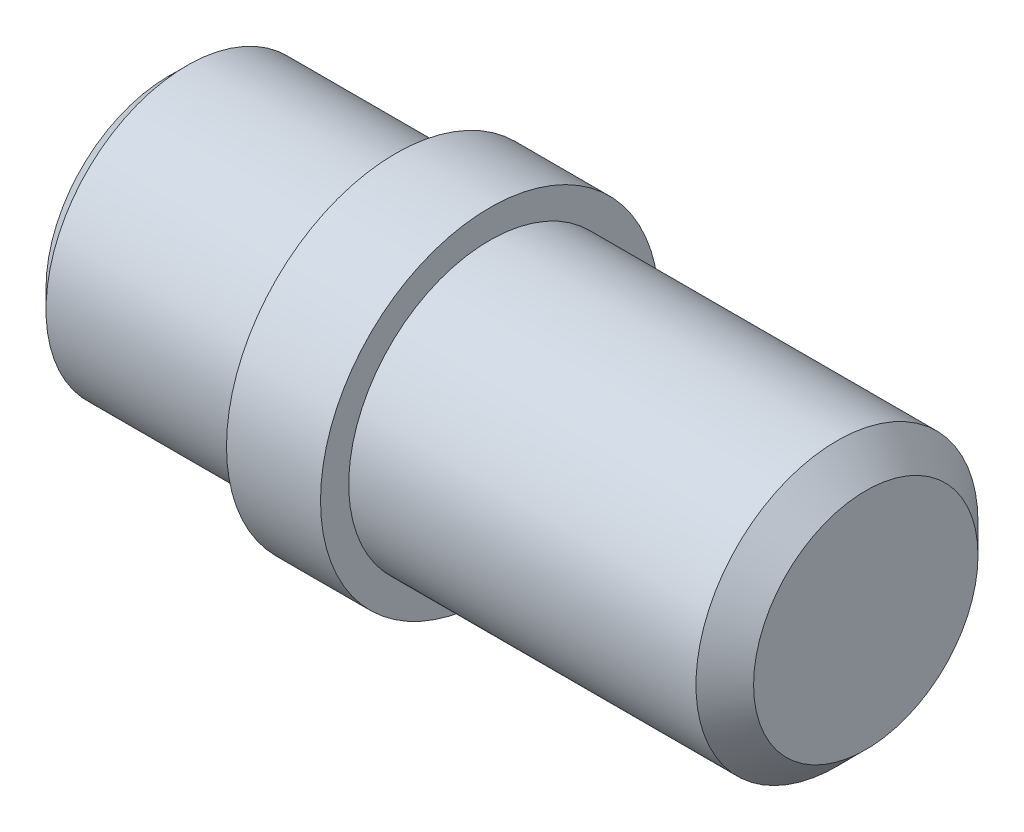
ISO-10303-21;
HEADER;
FILE_DESCRIPTION(('STEP AP214'),'2;1');
FILE_NAME('part.step','',(''),(''),'','','');
FILE_SCHEMA(('AUTOMOTIVE_DESIGN { 1 0 10303 214 1 1 1 1 }'));
ENDSEC;
DATA;
#1=APPLICATION_CONTEXT('core data for automotive mechanical design processes');
#2=APPLICATION_PROTOCOL_DEFINITION('international standard','automotive_design',2000,#1);
#3=PRODUCT_CONTEXT('',#1,'mechanical');
#4=PRODUCT('Part','Part','',(#3));
#5=PRODUCT_RELATED_PRODUCT_CATEGORY('part','',(#4));
#6=PRODUCT_DEFINITION_FORMATION('','',#4);
#7=PRODUCT_DEFINITION_CONTEXT('part definition',#1,'design');
#8=PRODUCT_DEFINITION('design','',#6,#7);
#9=PRODUCT_DEFINITION_SHAPE('','',#8);
#10=(LENGTH_UNIT() NAMED_UNIT(*) SI_UNIT(.MILLI.,.METRE.));
#11=(NAMED_UNIT(*) PLANE_ANGLE_UNIT() SI_UNIT($,.RADIAN.));
#12=(NAMED_UNIT(*) SI_UNIT($,.STERADIAN.) SOLID_ANGLE_UNIT());
#13=UNCERTAINTY_MEASURE_WITH_UNIT(LENGTH_MEASURE(1.E-05),#10,'distance_accuracy_value','');
#14=(GEOMETRIC_REPRESENTATION_CONTEXT(3) GLOBAL_UNCERTAINTY_ASSIGNED_CONTEXT((#13)) GLOBAL_UNIT_ASSIGNED_CONTEXT((#10,
#11,#12)) REPRESENTATION_CONTEXT('',''));
#15=CARTESIAN_POINT('',(0.,0.,0.));
#16=DIRECTION('',(0.,0.,1.));
#17=DIRECTION('',(1.,0.,0.));
#18=AXIS2_PLACEMENT_3D('',#15,#16,#17);
#19=CARTESIAN_POINT('',(-0.92,-0.86602540378444,0.375));
#20=DIRECTION('',(-1.,0.,0.));
#21=DIRECTION('',(0.,1.,0.));
#22=AXIS2_PLACEMENT_3D('',#19,#20,#21);
#23=PLANE('',#22);
#24=CARTESIAN_POINT('',(-0.92,0.,0.));
#25=DIRECTION('',(1.,0.,0.));
#26=DIRECTION('',(0.,-0.866025403784439,0.5));
#27=AXIS2_PLACEMENT_3D('',#24,#25,#26);
#28=CIRCLE('',#27,0.75);
#29=CARTESIAN_POINT('',(-0.92,-0.649519052838329,-0.375));
#30=VERTEX_POINT('',#29);
#31=CARTESIAN_POINT('',(-0.92,-0.649519052838329,0.375));
#32=VERTEX_POINT('',#31);
#33=EDGE_CURVE('E93',#30,#32,#28,.F.);
#34=ORIENTED_EDGE('',*,*,#33,.F.);
#35=DIRECTION('',(0.,-0.500000000000001,0.866025403784438));
#36=VECTOR('',#35,1.);
#37=CARTESIAN_POINT('',(-0.92,-0.64951905283833,-0.375));
#38=LINE('',#37,#36);
#39=CARTESIAN_POINT('',(-0.92,-0.86602540378444,0.));
#40=VERTEX_POINT('',#39);
#41=EDGE_CURVE('E107',#40,#30,#38,.F.);
#42=ORIENTED_EDGE('',*,*,#41,.F.);
#43=DIRECTION('',(0.,0.500000000000001,0.866025403784438));
#44=VECTOR('',#43,1.);
#45=CARTESIAN_POINT('',(-0.92,-0.86602540378444,0.));
#46=LINE('',#45,#44);
#47=EDGE_CURVE('E109',#32,#40,#46,.F.);
#48=ORIENTED_EDGE('',*,*,#47,.F.);
#49=EDGE_LOOP('',(#34,#42,#48));
#50=FACE_BOUND('',#49,.T.);
#51=ADVANCED_FACE('F17',(#50),#23,.T.);
#52=CARTESIAN_POINT('',(-0.92,-0.64951905283833,0.75));
#53=DIRECTION('',(-1.,0.,0.));
#54=DIRECTION('',(0.,1.,0.));
#55=AXIS2_PLACEMENT_3D('',#52,#53,#54);
#56=PLANE('',#55);
#57=CARTESIAN_POINT('',(-0.92,0.,0.));
#58=DIRECTION('',(1.,0.,0.));
#59=DIRECTION('',(0.,0.,1.));
#60=AXIS2_PLACEMENT_3D('',#57,#58,#59);
#61=CIRCLE('',#60,0.75);
#62=CARTESIAN_POINT('',(-0.92,0.,0.75));
#63=VERTEX_POINT('',#62);
#64=EDGE_CURVE('E250',#32,#63,#61,.F.);
#65=ORIENTED_EDGE('',*,*,#64,.F.);
#66=DIRECTION('',(0.,0.5,0.866025403784438));
#67=VECTOR('',#66,1.);
#68=CARTESIAN_POINT('',(-0.92,-0.64951905283833,0.375));
#69=LINE('',#68,#67);
#70=CARTESIAN_POINT('',(-0.92,-0.43301270189222,0.75));
#71=VERTEX_POINT('',#70);
#72=EDGE_CURVE('E247',#71,#32,#69,.F.);
#73=ORIENTED_EDGE('',*,*,#72,.F.);
#74=DIRECTION('',(0.,1.,0.));
#75=VECTOR('',#74,1.);
#76=CARTESIAN_POINT('',(-0.92,-0.43301270189222,0.75));
#77=LINE('',#76,#75);
#78=EDGE_CURVE('E243',#63,#71,#77,.F.);
#79=ORIENTED_EDGE('',*,*,#78,.F.);
#80=EDGE_LOOP('',(#65,#73,#79));
#81=FACE_BOUND('',#80,.T.);
#82=ADVANCED_FACE('F249',(#81),#56,.T.);
#83=CARTESIAN_POINT('',(-0.92,0.,0.75));
#84=DIRECTION('',(-1.,0.,0.));
#85=DIRECTION('',(0.,1.,0.));
#86=AXIS2_PLACEMENT_3D('',#83,#84,#85);
#87=PLANE('',#86);
#88=CARTESIAN_POINT('',(-0.92,0.,0.));
#89=DIRECTION('',(1.,0.,0.));
#90=DIRECTION('',(0.,0.866025403784439,0.5));
#91=AXIS2_PLACEMENT_3D('',#88,#89,#90);
#92=CIRCLE('',#91,0.75);
#93=CARTESIAN_POINT('',(-0.92,0.649519052838329,0.375));
#94=VERTEX_POINT('',#93);
#95=EDGE_CURVE('E252',#63,#94,#92,.F.);
#96=ORIENTED_EDGE('',*,*,#95,.F.);
#97=DIRECTION('',(0.,1.,0.));
#98=VECTOR('',#97,1.);
#99=CARTESIAN_POINT('',(-0.92,0.,0.75));
#100=LINE('',#99,#98);
#101=CARTESIAN_POINT('',(-0.92,0.43301270189222,0.75));
#102=VERTEX_POINT('',#101);
#103=EDGE_CURVE('E264',#102,#63,#100,.F.);
#104=ORIENTED_EDGE('',*,*,#103,.F.);
#105=DIRECTION('',(0.,0.499999999999999,-0.866025403784439));
#106=VECTOR('',#105,1.);
#107=CARTESIAN_POINT('',(-0.92,0.43301270189222,0.75));
#108=LINE('',#107,#106);
#109=EDGE_CURVE('E268',#94,#102,#108,.F.);
#110=ORIENTED_EDGE('',*,*,#109,.F.);
#111=EDGE_LOOP('',(#96,#104,#110));
#112=FACE_BOUND('',#111,.T.);
#113=ADVANCED_FACE('F300',(#112),#87,.T.);
#114=CARTESIAN_POINT('',(-0.92,0.649519052838329,0.375000000000001));
#115=DIRECTION('',(-1.,0.,0.));
#116=DIRECTION('',(0.,1.,0.));
#117=AXIS2_PLACEMENT_3D('',#114,#115,#116);
#118=PLANE('',#117);
#119=CARTESIAN_POINT('',(-0.92,0.,0.));
#120=DIRECTION('',(1.,0.,0.));
#121=DIRECTION('',(0.,0.866025403784439,-0.5));
#122=AXIS2_PLACEMENT_3D('',#119,#120,#121);
#123=CIRCLE('',#122,0.75);
#124=CARTESIAN_POINT('',(-0.92,0.649519052838329,-0.375));
#125=VERTEX_POINT('',#124);
#126=EDGE_CURVE('E272',#94,#125,#123,.F.);
#127=ORIENTED_EDGE('',*,*,#126,.F.);
#128=DIRECTION('',(0.,0.500000000000002,-0.866025403784438));
#129=VECTOR('',#128,1.);
#130=CARTESIAN_POINT('',(-0.92,0.649519052838329,0.375));
#131=LINE('',#130,#129);
#132=CARTESIAN_POINT('',(-0.92,0.86602540378444,0.));
#133=VERTEX_POINT('',#132);
#134=EDGE_CURVE('E276',#133,#94,#131,.F.);
#135=ORIENTED_EDGE('',*,*,#134,.F.);
#136=DIRECTION('',(0.,-0.500000000000001,-0.866025403784438));
#137=VECTOR('',#136,1.);
#138=CARTESIAN_POINT('',(-0.92,0.86602540378444,0.));
#139=LINE('',#138,#137);
#140=EDGE_CURVE('E101',#125,#133,#139,.F.);
#141=ORIENTED_EDGE('',*,*,#140,.F.);
#142=EDGE_LOOP('',(#127,#135,#141));
#143=FACE_BOUND('',#142,.T.);
#144=ADVANCED_FACE('F294',(#143),#118,.T.);
#145=CARTESIAN_POINT('',(-0.92,-0.64951905283833,-0.375));
#146=DIRECTION('',(-1.,0.,0.));
#147=DIRECTION('',(0.,1.,0.));
#148=AXIS2_PLACEMENT_3D('',#145,#146,#147);
#149=PLANE('',#148);
#150=CARTESIAN_POINT('',(-0.92,0.,0.));
#151=DIRECTION('',(1.,0.,0.));
#152=DIRECTION('',(0.,-0.866025403784439,-0.5));
#153=AXIS2_PLACEMENT_3D('',#150,#151,#152);
#154=CIRCLE('',#153,0.75);
#155=CARTESIAN_POINT('',(-0.92,0.,-0.75));
#156=VERTEX_POINT('',#155);
#157=EDGE_CURVE('E90',#156,#30,#154,.F.);
#158=ORIENTED_EDGE('',*,*,#157,.F.);
#159=DIRECTION('',(0.,-1.,0.));
#160=VECTOR('',#159,1.);
#161=CARTESIAN_POINT('',(-0.92,0.,-0.75));
#162=LINE('',#161,#160);
#163=CARTESIAN_POINT('',(-0.92,-0.43301270189222,-0.75));
#164=VERTEX_POINT('',#163);
#165=EDGE_CURVE('E100',#164,#156,#162,.F.);
#166=ORIENTED_EDGE('',*,*,#165,.F.);
#167=DIRECTION('',(0.,-0.499999999999999,0.866025403784439));
#168=VECTOR('',#167,1.);
#169=CARTESIAN_POINT('',(-0.92,-0.43301270189222,-0.75));
#170=LINE('',#169,#168);
#171=EDGE_CURVE('E115',#30,#164,#170,.F.);
#172=ORIENTED_EDGE('',*,*,#171,.F.);
#173=EDGE_LOOP('',(#158,#166,#172));
#174=FACE_BOUND('',#173,.T.);
#175=ADVANCED_FACE('F119',(#174),#149,.T.);
#176=CARTESIAN_POINT('',(-2.42,-1.31692094624868,1.30000003686051));
#177=DIRECTION('',(-1.,0.,0.));
#178=DIRECTION('',(0.,1.,0.));
#179=AXIS2_PLACEMENT_3D('',#176,#177,#178);
#180=PLANE('',#179);
#181=CARTESIAN_POINT('',(-2.42,0.,0.));
#182=DIRECTION('',(-1.,0.,0.));
#183=DIRECTION('',(0.,0.,-1.));
#184=AXIS2_PLACEMENT_3D('',#181,#182,#183);
#185=CIRCLE('',#184,1.3);
#186=CARTESIAN_POINT('',(-2.42,0.,-1.3));
#187=VERTEX_POINT('',#186);
#188=EDGE_CURVE('E120',#187,#187,#185,.F.);
#189=ORIENTED_EDGE('',*,*,#188,.F.);
#190=EDGE_LOOP('',(#189));
#191=FACE_BOUND('',#190,.T.);
#192=DIRECTION('',(0.,-1.,0.));
#193=VECTOR('',#192,1.);
#194=CARTESIAN_POINT('',(-2.42,0.43301270189222,0.75));
#195=LINE('',#194,#193);
#196=CARTESIAN_POINT('',(-2.42,0.43301270189222,0.75));
#197=VERTEX_POINT('',#196);
#198=CARTESIAN_POINT('',(-2.42,-0.43301270189222,0.75));
#199=VERTEX_POINT('',#198);
#200=EDGE_CURVE('E123',#197,#199,#195,.T.);
#201=ORIENTED_EDGE('',*,*,#200,.T.);
#202=DIRECTION('',(0.,-0.5,-0.866025403784439));
#203=VECTOR('',#202,1.);
#204=CARTESIAN_POINT('',(-2.42,-0.43301270189222,0.75));
#205=LINE('',#204,#203);
#206=CARTESIAN_POINT('',(-2.42,-0.86602540378444,0.));
#207=VERTEX_POINT('',#206);
#208=EDGE_CURVE('E133',#199,#207,#205,.T.);
#209=ORIENTED_EDGE('',*,*,#208,.T.);
#210=DIRECTION('',(0.,0.5,-0.866025403784439));
#211=VECTOR('',#210,1.);
#212=CARTESIAN_POINT('',(-2.42,-0.86602540378444,0.));
#213=LINE('',#212,#211);
#214=CARTESIAN_POINT('',(-2.42,-0.43301270189222,-0.750000000000001));
#215=VERTEX_POINT('',#214);
#216=EDGE_CURVE('E138',#207,#215,#213,.T.);
#217=ORIENTED_EDGE('',*,*,#216,.T.);
#218=DIRECTION('',(0.,1.,0.));
#219=VECTOR('',#218,1.);
#220=CARTESIAN_POINT('',(-2.42,-0.43301270189222,-0.75));
#221=LINE('',#220,#219);
#222=CARTESIAN_POINT('',(-2.42,0.43301270189222,-0.75));
#223=VERTEX_POINT('',#222);
#224=EDGE_CURVE('E143',#215,#223,#221,.T.);
#225=ORIENTED_EDGE('',*,*,#224,.T.);
#226=DIRECTION('',(0.,0.5,0.866025403784438));
#227=VECTOR('',#226,1.);
#228=CARTESIAN_POINT('',(-2.42,0.43301270189222,-0.75));
#229=LINE('',#228,#227);
#230=CARTESIAN_POINT('',(-2.42,0.86602540378444,0.));
#231=VERTEX_POINT('',#230);
#232=EDGE_CURVE('E148',#223,#231,#229,.T.);
#233=ORIENTED_EDGE('',*,*,#232,.T.);
#234=DIRECTION('',(0.,-0.5,0.866025403784439));
#235=VECTOR('',#234,1.);
#236=CARTESIAN_POINT('',(-2.42,0.86602540378444,0.));
#237=LINE('',#236,#235);
#238=EDGE_CURVE('E153',#231,#197,#237,.T.);
#239=ORIENTED_EDGE('',*,*,#238,.T.);
#240=EDGE_LOOP('',(#201,#209,#217,#225,#233,#239));
#241=FACE_BOUND('',#240,.T.);
#242=ADVANCED_FACE('F231',(#191,#241),#180,.T.);
#243=CARTESIAN_POINT('',(0.,-1.80000000000001,1.80000013817222));
#244=DIRECTION('',(-1.,0.,0.));
#245=DIRECTION('',(0.,1.,0.));
#246=AXIS2_PLACEMENT_3D('',#243,#244,#245);
#247=PLANE('',#246);
#248=CARTESIAN_POINT('',(0.,0.,0.));
#249=DIRECTION('',(-1.,0.,0.));
#250=DIRECTION('',(0.,0.,-1.));
#251=AXIS2_PLACEMENT_3D('',#248,#249,#250);
#252=CIRCLE('',#251,1.8);
#253=CARTESIAN_POINT('',(0.,0.,-1.8));
#254=VERTEX_POINT('',#253);
#255=EDGE_CURVE('E158',#254,#254,#252,.F.);
#256=ORIENTED_EDGE('',*,*,#255,.F.);
#257=EDGE_LOOP('',(#256));
#258=FACE_BOUND('',#257,.T.);
#259=CARTESIAN_POINT('',(0.,0.,0.));
#260=DIRECTION('',(1.,0.,0.));
#261=DIRECTION('',(0.,0.,1.));
#262=AXIS2_PLACEMENT_3D('',#259,#260,#261);
#263=CIRCLE('',#262,1.54000000145994);
#264=CARTESIAN_POINT('',(0.,0.,1.54000000145994));
#265=VERTEX_POINT('',#264);
#266=EDGE_CURVE('E163',#265,#265,#263,.T.);
#267=ORIENTED_EDGE('',*,*,#266,.T.);
#268=EDGE_LOOP('',(#267));
#269=FACE_BOUND('',#268,.T.);
#270=ADVANCED_FACE('F234',(#258,#269),#247,.T.);
#271=CARTESIAN_POINT('',(1.,-1.8,-1.8));
#272=DIRECTION('',(1.,0.,0.));
#273=DIRECTION('',(0.,1.,0.));
#274=AXIS2_PLACEMENT_3D('',#271,#272,#273);
#275=PLANE('',#274);
#276=CARTESIAN_POINT('',(1.,0.,0.));
#277=DIRECTION('',(1.,0.,0.));
#278=DIRECTION('',(0.,0.,1.));
#279=AXIS2_PLACEMENT_3D('',#276,#277,#278);
#280=CIRCLE('',#279,1.8);
#281=CARTESIAN_POINT('',(1.,0.,1.8));
#282=VERTEX_POINT('',#281);
#283=EDGE_CURVE('E166',#282,#282,#280,.T.);
#284=ORIENTED_EDGE('',*,*,#283,.T.);
#285=EDGE_LOOP('',(#284));
#286=FACE_BOUND('',#285,.T.);
#287=CARTESIAN_POINT('',(1.,0.,0.));
#288=DIRECTION('',(-1.,0.,0.));
#289=DIRECTION('',(0.,0.,-1.));
#290=AXIS2_PLACEMENT_3D('',#287,#288,#289);
#291=CIRCLE('',#290,1.5);
#292=CARTESIAN_POINT('',(1.,0.,-1.5));
#293=VERTEX_POINT('',#292);
#294=EDGE_CURVE('E169',#293,#293,#291,.F.);
#295=ORIENTED_EDGE('',*,*,#294,.F.);
#296=EDGE_LOOP('',(#295));
#297=FACE_BOUND('',#296,.T.);
#298=ADVANCED_FACE('F334',(#286,#297),#275,.T.);
#299=CARTESIAN_POINT('',(5.,-1.20903464106758,-1.1935));
#300=DIRECTION('',(1.,0.,0.));
#301=DIRECTION('',(0.,1.,0.));
#302=AXIS2_PLACEMENT_3D('',#299,#300,#301);
#303=PLANE('',#302);
#304=CARTESIAN_POINT('',(5.,0.,0.));
#305=DIRECTION('',(1.,0.,0.));
#306=DIRECTION('',(0.,-1.41924965844718E-07,0.99999999999999));
#307=AXIS2_PLACEMENT_3D('',#304,#305,#306);
#308=CIRCLE('',#307,1.1935);
#309=CARTESIAN_POINT('',(5.,-1.6938744673567E-07,1.19349999999999));
#310=VERTEX_POINT('',#309);
#311=EDGE_CURVE('E172',#310,#310,#308,.T.);
#312=ORIENTED_EDGE('',*,*,#311,.T.);
#313=EDGE_LOOP('',(#312));
#314=FACE_BOUND('',#313,.T.);
#315=ADVANCED_FACE('F338',(#314),#303,.T.);
#316=CARTESIAN_POINT('',(-0.92,-0.43301270189222,0.75));
#317=DIRECTION('',(0.,0.,-1.));
#318=DIRECTION('',(-1.,0.,0.));
#319=AXIS2_PLACEMENT_3D('',#316,#317,#318);
#320=PLANE('',#319);
#321=ORIENTED_EDGE('',*,*,#200,.F.);
#322=DIRECTION('',(1.,0.,0.));
#323=VECTOR('',#322,1.);
#324=CARTESIAN_POINT('',(-2.42,0.43301270189222,0.75));
#325=LINE('',#324,#323);
#326=EDGE_CURVE('E175',#102,#197,#325,.F.);
#327=ORIENTED_EDGE('',*,*,#326,.F.);
#328=ORIENTED_EDGE('',*,*,#103,.T.);
#329=ORIENTED_EDGE('',*,*,#78,.T.);
#330=DIRECTION('',(-1.,0.,0.));
#331=VECTOR('',#330,1.);
#332=CARTESIAN_POINT('',(-0.92,-0.43301270189222,0.75));
#333=LINE('',#332,#331);
#334=EDGE_CURVE('E177',#71,#199,#333,.T.);
#335=ORIENTED_EDGE('',*,*,#334,.T.);
#336=EDGE_LOOP('',(#321,#327,#328,#329,#335));
#337=FACE_BOUND('',#336,.T.);
#338=ADVANCED_FACE('F239',(#337),#320,.T.);
#339=CARTESIAN_POINT('',(-2.42,-0.866025403784439,0.));
#340=DIRECTION('',(0.,0.866025403784439,-0.5));
#341=DIRECTION('',(0.,0.5,0.866025403784439));
#342=AXIS2_PLACEMENT_3D('',#339,#340,#341);
#343=PLANE('',#342);
#344=ORIENTED_EDGE('',*,*,#208,.F.);
#345=ORIENTED_EDGE('',*,*,#334,.F.);
#346=ORIENTED_EDGE('',*,*,#72,.T.);
#347=ORIENTED_EDGE('',*,*,#47,.T.);
#348=DIRECTION('',(-1.,0.,0.));
#349=VECTOR('',#348,1.);
#350=CARTESIAN_POINT('',(-0.92,-0.866025403784439,0.));
#351=LINE('',#350,#349);
#352=EDGE_CURVE('E117',#40,#207,#351,.T.);
#353=ORIENTED_EDGE('',*,*,#352,.T.);
#354=EDGE_LOOP('',(#344,#345,#346,#347,#353));
#355=FACE_BOUND('',#354,.T.);
#356=ADVANCED_FACE('F246',(#355),#343,.T.);
#357=CARTESIAN_POINT('',(-2.42,-0.433012701892221,-0.75));
#358=DIRECTION('',(0.,0.866025403784439,0.5));
#359=DIRECTION('',(0.,-0.5,0.866025403784439));
#360=AXIS2_PLACEMENT_3D('',#357,#358,#359);
#361=PLANE('',#360);
#362=ORIENTED_EDGE('',*,*,#216,.F.);
#363=ORIENTED_EDGE('',*,*,#352,.F.);
#364=ORIENTED_EDGE('',*,*,#41,.T.);
#365=ORIENTED_EDGE('',*,*,#171,.T.);
#366=DIRECTION('',(-1.,0.,0.));
#367=VECTOR('',#366,1.);
#368=CARTESIAN_POINT('',(-0.92,-0.433012701892221,-0.75));
#369=LINE('',#368,#367);
#370=EDGE_CURVE('E185',#164,#215,#369,.T.);
#371=ORIENTED_EDGE('',*,*,#370,.T.);
#372=EDGE_LOOP('',(#362,#363,#364,#365,#371));
#373=FACE_BOUND('',#372,.T.);
#374=ADVANCED_FACE('F113',(#373),#361,.T.);
#375=CARTESIAN_POINT('',(-2.42,-0.43301270189222,-0.75));
#376=DIRECTION('',(0.,0.,1.));
#377=DIRECTION('',(1.,0.,0.));
#378=AXIS2_PLACEMENT_3D('',#375,#376,#377);
#379=PLANE('',#378);
#380=ORIENTED_EDGE('',*,*,#224,.F.);
#381=ORIENTED_EDGE('',*,*,#370,.F.);
#382=ORIENTED_EDGE('',*,*,#165,.T.);
#383=DIRECTION('',(0.,1.,0.));
#384=VECTOR('',#383,1.);
#385=CARTESIAN_POINT('',(-0.92,0.,-0.75));
#386=LINE('',#385,#384);
#387=CARTESIAN_POINT('',(-0.92,0.43301270189222,-0.75));
#388=VERTEX_POINT('',#387);
#389=EDGE_CURVE('E189',#156,#388,#386,.T.);
#390=ORIENTED_EDGE('',*,*,#389,.T.);
#391=DIRECTION('',(-1.,0.,0.));
#392=VECTOR('',#391,1.);
#393=CARTESIAN_POINT('',(-0.92,0.43301270189222,-0.75));
#394=LINE('',#393,#392);
#395=EDGE_CURVE('E193',#388,#223,#394,.T.);
#396=ORIENTED_EDGE('',*,*,#395,.T.);
#397=EDGE_LOOP('',(#380,#381,#382,#390,#396));
#398=FACE_BOUND('',#397,.T.);
#399=ADVANCED_FACE('F302',(#398),#379,.T.);
#400=CARTESIAN_POINT('',(-2.42,0.866025403784439,0.));
#401=DIRECTION('',(0.,-0.866025403784439,0.5));
#402=DIRECTION('',(0.,-0.5,-0.866025403784439));
#403=AXIS2_PLACEMENT_3D('',#400,#401,#402);
#404=PLANE('',#403);
#405=ORIENTED_EDGE('',*,*,#232,.F.);
#406=ORIENTED_EDGE('',*,*,#395,.F.);
#407=DIRECTION('',(0.,0.5,0.866025403784439));
#408=VECTOR('',#407,1.);
#409=CARTESIAN_POINT('',(-0.92,0.43301270189222,-0.75));
#410=LINE('',#409,#408);
#411=EDGE_CURVE('E35',#388,#125,#410,.T.);
#412=ORIENTED_EDGE('',*,*,#411,.T.);
#413=ORIENTED_EDGE('',*,*,#140,.T.);
#414=DIRECTION('',(-1.,0.,0.));
#415=VECTOR('',#414,1.);
#416=CARTESIAN_POINT('',(-0.92,0.866025403784439,0.));
#417=LINE('',#416,#415);
#418=EDGE_CURVE('E201',#133,#231,#417,.T.);
#419=ORIENTED_EDGE('',*,*,#418,.T.);
#420=EDGE_LOOP('',(#405,#406,#412,#413,#419));
#421=FACE_BOUND('',#420,.T.);
#422=ADVANCED_FACE('F289',(#421),#404,.T.);
#423=CARTESIAN_POINT('',(-2.42,0.433012701892221,0.75));
#424=DIRECTION('',(0.,-0.866025403784439,-0.5));
#425=DIRECTION('',(0.,0.5,-0.866025403784439));
#426=AXIS2_PLACEMENT_3D('',#423,#424,#425);
#427=PLANE('',#426);
#428=ORIENTED_EDGE('',*,*,#238,.F.);
#429=ORIENTED_EDGE('',*,*,#418,.F.);
#430=ORIENTED_EDGE('',*,*,#134,.T.);
#431=ORIENTED_EDGE('',*,*,#109,.T.);
#432=ORIENTED_EDGE('',*,*,#326,.T.);
#433=EDGE_LOOP('',(#428,#429,#430,#431,#432));
#434=FACE_BOUND('',#433,.T.);
#435=ADVANCED_FACE('F297',(#434),#427,.T.);
#436=CARTESIAN_POINT('',(-0.92,0.,-0.375));
#437=DIRECTION('',(-1.,0.,0.));
#438=DIRECTION('',(0.,1.,0.));
#439=AXIS2_PLACEMENT_3D('',#436,#437,#438);
#440=PLANE('',#439);
#441=CARTESIAN_POINT('',(-0.92,0.,0.));
#442=DIRECTION('',(1.,0.,0.));
#443=DIRECTION('',(0.,0.,-1.));
#444=AXIS2_PLACEMENT_3D('',#441,#442,#443);
#445=CIRCLE('',#444,0.75);
#446=EDGE_CURVE('E95',#125,#156,#445,.F.);
#447=ORIENTED_EDGE('',*,*,#446,.F.);
#448=ORIENTED_EDGE('',*,*,#411,.F.);
#449=ORIENTED_EDGE('',*,*,#389,.F.);
#450=EDGE_LOOP('',(#447,#448,#449));
#451=FACE_BOUND('',#450,.T.);
#452=ADVANCED_FACE('F227',(#451),#440,.T.);
#453=CARTESIAN_POINT('',(-2.22,0.,0.));
#454=DIRECTION('',(1.,0.,0.));
#455=DIRECTION('',(0.,1.41610110427133E-07,0.99999999999999));
#456=AXIS2_PLACEMENT_3D('',#453,#454,#455);
#457=CONICAL_SURFACE('',#456,1.5,0.785398163397449);
#458=CARTESIAN_POINT('',(-2.22,0.,0.));
#459=DIRECTION('',(-1.,0.,0.));
#460=DIRECTION('',(0.,0.,-1.));
#461=AXIS2_PLACEMENT_3D('',#458,#459,#460);
#462=CIRCLE('',#461,1.5);
#463=CARTESIAN_POINT('',(-2.22,0.,-1.5));
#464=VERTEX_POINT('',#463);
#465=EDGE_CURVE('E209',#464,#464,#462,.F.);
#466=ORIENTED_EDGE('',*,*,#465,.F.);
#467=EDGE_LOOP('',(#466));
#468=FACE_BOUND('',#467,.T.);
#469=ORIENTED_EDGE('',*,*,#188,.T.);
#470=EDGE_LOOP('',(#469));
#471=FACE_BOUND('',#470,.T.);
#472=ADVANCED_FACE('F221',(#468,#471),#457,.T.);
#473=CARTESIAN_POINT('',(1.,0.,0.));
#474=DIRECTION('',(1.,0.,0.));
#475=DIRECTION('',(0.,7.69327835111053E-10,1.));
#476=AXIS2_PLACEMENT_3D('',#473,#474,#475);
#477=CYLINDRICAL_SURFACE('',#476,1.5);
#478=CARTESIAN_POINT('',(-0.04,0.,0.));
#479=DIRECTION('',(-1.,0.,0.));
#480=DIRECTION('',(0.,0.,-1.));
#481=AXIS2_PLACEMENT_3D('',#478,#479,#480);
#482=CIRCLE('',#481,1.5);
#483=CARTESIAN_POINT('',(-0.04,0.,-1.5));
#484=VERTEX_POINT('',#483);
#485=EDGE_CURVE('E25',#484,#484,#482,.F.);
#486=ORIENTED_EDGE('',*,*,#485,.F.);
#487=EDGE_LOOP('',(#486));
#488=FACE_BOUND('',#487,.T.);
#489=ORIENTED_EDGE('',*,*,#465,.T.);
#490=EDGE_LOOP('',(#489));
#491=FACE_BOUND('',#490,.T.);
#492=ADVANCED_FACE('F218',(#488,#491),#477,.T.);
#493=CARTESIAN_POINT('',(-0.0399999999999348,0.,0.));
#494=DIRECTION('',(1.,0.,0.));
#495=DIRECTION('',(0.,1.92318283860768E-10,1.));
#496=AXIS2_PLACEMENT_3D('',#493,#494,#495);
#497=TOROIDAL_SURFACE('',#496,1.53999999999993,0.0399999999999349);
#498=ORIENTED_EDGE('',*,*,#266,.F.);
#499=EDGE_LOOP('',(#498));
#500=FACE_BOUND('',#499,.T.);
#501=ORIENTED_EDGE('',*,*,#485,.T.);
#502=EDGE_LOOP('',(#501));
#503=FACE_BOUND('',#502,.T.);
#504=ADVANCED_FACE('F216',(#500,#503),#497,.F.);
#505=CARTESIAN_POINT('',(1.,0.,0.));
#506=DIRECTION('',(1.,0.,0.));
#507=DIRECTION('',(0.,1.42036729611557E-07,0.99999999999999));
#508=AXIS2_PLACEMENT_3D('',#505,#506,#507);
#509=CYLINDRICAL_SURFACE('',#508,1.8);
#510=ORIENTED_EDGE('',*,*,#283,.F.);
#511=EDGE_LOOP('',(#510));
#512=FACE_BOUND('',#511,.T.);
#513=ORIENTED_EDGE('',*,*,#255,.T.);
#514=EDGE_LOOP('',(#513));
#515=FACE_BOUND('',#514,.T.);
#516=ADVANCED_FACE('F406',(#512,#515),#509,.T.);
#517=CARTESIAN_POINT('',(5.,0.,0.));
#518=DIRECTION('',(1.,0.,0.));
#519=DIRECTION('',(0.,0.,1.));
#520=AXIS2_PLACEMENT_3D('',#517,#518,#519);
#521=CYLINDRICAL_SURFACE('',#520,1.5);
#522=CARTESIAN_POINT('',(4.6935,0.,0.));
#523=DIRECTION('',(-1.,0.,0.));
#524=DIRECTION('',(0.,0.,-1.));
#525=AXIS2_PLACEMENT_3D('',#522,#523,#524);
#526=CIRCLE('',#525,1.5);
#527=CARTESIAN_POINT('',(4.6935,0.,-1.5));
#528=VERTEX_POINT('',#527);
#529=EDGE_CURVE('E11',#528,#528,#526,.F.);
#530=ORIENTED_EDGE('',*,*,#529,.F.);
#531=EDGE_LOOP('',(#530));
#532=FACE_BOUND('',#531,.T.);
#533=ORIENTED_EDGE('',*,*,#294,.T.);
#534=EDGE_LOOP('',(#533));
#535=FACE_BOUND('',#534,.T.);
#536=ADVANCED_FACE('F416',(#532,#535),#521,.T.);
#537=CARTESIAN_POINT('',(4.6935,0.,0.));
#538=DIRECTION('',(-1.,0.,0.));
#539=DIRECTION('',(0.,0.,-1.));
#540=AXIS2_PLACEMENT_3D('',#537,#538,#539);
#541=CONICAL_SURFACE('',#540,1.5,0.785398163397448);
#542=ORIENTED_EDGE('',*,*,#311,.F.);
#543=EDGE_LOOP('',(#542));
#544=FACE_BOUND('',#543,.T.);
#545=ORIENTED_EDGE('',*,*,#529,.T.);
#546=EDGE_LOOP('',(#545));
#547=FACE_BOUND('',#546,.T.);
#548=ADVANCED_FACE('F426',(#544,#547),#541,.T.);
#549=CARTESIAN_POINT('',(-0.92,0.,0.));
#550=DIRECTION('',(-1.,0.,0.));
#551=DIRECTION('',(0.,0.,-1.));
#552=AXIS2_PLACEMENT_3D('',#549,#550,#551);
#553=CONICAL_SURFACE('',#552,0.75,1.0471975511966);
#554=ORIENTED_EDGE('',*,*,#157,.T.);
#555=ORIENTED_EDGE('',*,*,#33,.T.);
#556=ORIENTED_EDGE('',*,*,#64,.T.);
#557=ORIENTED_EDGE('',*,*,#95,.T.);
#558=ORIENTED_EDGE('',*,*,#126,.T.);
#559=ORIENTED_EDGE('',*,*,#446,.T.);
#560=EDGE_LOOP('',(#554,#555,#556,#557,#558,#559));
#561=FACE_BOUND('',#560,.T.);
#562=CARTESIAN_POINT('',(-0.486987298107781,0.,0.));
#563=VERTEX_POINT('',#562);
#564=VERTEX_LOOP('',#563);
#565=FACE_BOUND('',#564,.T.);
#566=ADVANCED_FACE('F19',(#561,#565),#553,.F.);
#567=CLOSED_SHELL('',(#51,#82,#113,#144,#175,#242,#270,#298,#315,#338,#356,#374,#399,#422,#435,
#452,#472,#492,#504,#516,#536,#548,#566));
#568=MANIFOLD_SOLID_BREP('B1',#567);
#569=ADVANCED_BREP_SHAPE_REPRESENTATION('',(#18,#568),#14);
#570=SHAPE_DEFINITION_REPRESENTATION(#9,#569);
ENDSEC;
END-ISO-10303-21;
